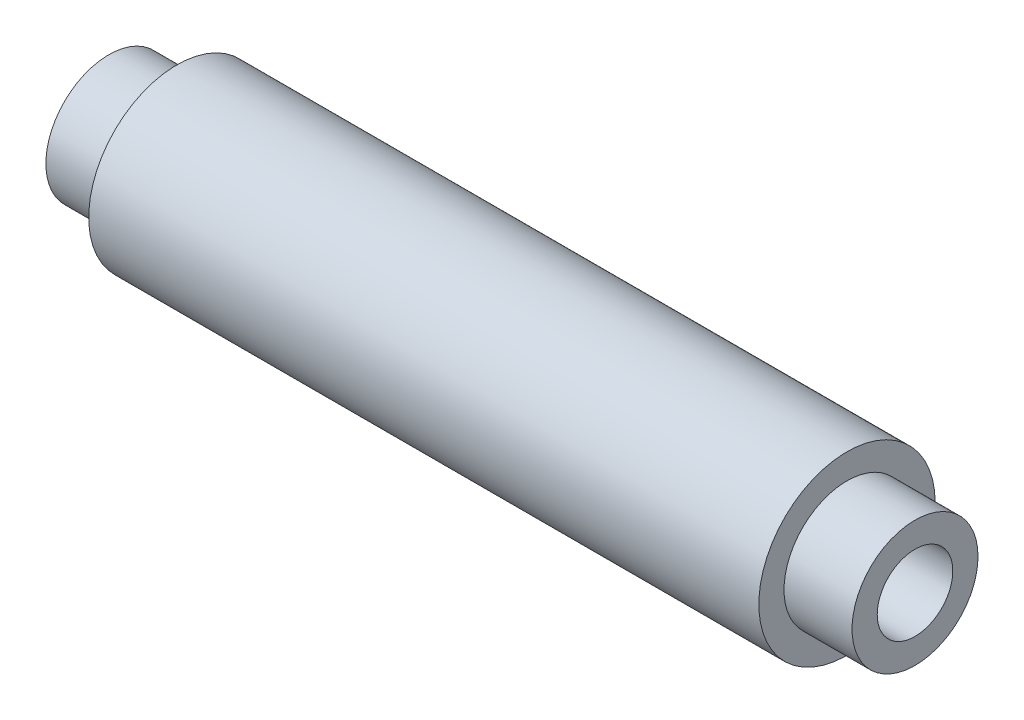
ISO-10303-21;
HEADER;
FILE_DESCRIPTION(('STEP AP214'),'2;1');
FILE_NAME('part.step','',(''),(''),'','','');
FILE_SCHEMA(('AUTOMOTIVE_DESIGN { 1 0 10303 214 1 1 1 1 }'));
ENDSEC;
DATA;
#1=APPLICATION_CONTEXT('core data for automotive mechanical design processes');
#2=APPLICATION_PROTOCOL_DEFINITION('international standard','automotive_design',2000,#1);
#3=PRODUCT_CONTEXT('',#1,'mechanical');
#4=PRODUCT('Part','Part','',(#3));
#5=PRODUCT_RELATED_PRODUCT_CATEGORY('part','',(#4));
#6=PRODUCT_DEFINITION_FORMATION('','',#4);
#7=PRODUCT_DEFINITION_CONTEXT('part definition',#1,'design');
#8=PRODUCT_DEFINITION('design','',#6,#7);
#9=PRODUCT_DEFINITION_SHAPE('','',#8);
#10=(LENGTH_UNIT() NAMED_UNIT(*) SI_UNIT(.MILLI.,.METRE.));
#11=(NAMED_UNIT(*) PLANE_ANGLE_UNIT() SI_UNIT($,.RADIAN.));
#12=(NAMED_UNIT(*) SI_UNIT($,.STERADIAN.) SOLID_ANGLE_UNIT());
#13=UNCERTAINTY_MEASURE_WITH_UNIT(LENGTH_MEASURE(1.E-05),#10,'distance_accuracy_value','');
#14=(GEOMETRIC_REPRESENTATION_CONTEXT(3) GLOBAL_UNCERTAINTY_ASSIGNED_CONTEXT((#13)) GLOBAL_UNIT_ASSIGNED_CONTEXT((#10,
#11,#12)) REPRESENTATION_CONTEXT('',''));
#15=CARTESIAN_POINT('',(0.,0.,0.));
#16=DIRECTION('',(0.,0.,1.));
#17=DIRECTION('',(1.,0.,0.));
#18=AXIS2_PLACEMENT_3D('',#15,#16,#17);
#19=CARTESIAN_POINT('',(-16.,0.,0.));
#20=DIRECTION('',(-1.,0.,0.));
#21=DIRECTION('',(0.,0.,1.));
#22=AXIS2_PLACEMENT_3D('',#19,#20,#21);
#23=CYLINDRICAL_SURFACE('',#22,1.5);
#24=CARTESIAN_POINT('',(-16.,0.,0.));
#25=DIRECTION('',(-1.,0.,0.));
#26=DIRECTION('',(0.,0.,1.));
#27=AXIS2_PLACEMENT_3D('',#24,#25,#26);
#28=CIRCLE('',#27,1.5);
#29=CARTESIAN_POINT('',(-16.,0.,1.5));
#30=VERTEX_POINT('',#29);
#31=EDGE_CURVE('E51',#30,#30,#28,.T.);
#32=ORIENTED_EDGE('',*,*,#31,.T.);
#33=EDGE_LOOP('',(#32));
#34=FACE_BOUND('',#33,.T.);
#35=CARTESIAN_POINT('',(16.,0.,0.));
#36=DIRECTION('',(-1.,0.,0.));
#37=DIRECTION('',(0.,0.,1.));
#38=AXIS2_PLACEMENT_3D('',#35,#36,#37);
#39=CIRCLE('',#38,1.5);
#40=CARTESIAN_POINT('',(16.,0.,1.5));
#41=VERTEX_POINT('',#40);
#42=EDGE_CURVE('E56',#41,#41,#39,.T.);
#43=ORIENTED_EDGE('',*,*,#42,.F.);
#44=EDGE_LOOP('',(#43));
#45=FACE_BOUND('',#44,.T.);
#46=ADVANCED_FACE('F15',(#34,#45),#23,.F.);
#47=CARTESIAN_POINT('',(16.,0.,0.));
#48=DIRECTION('',(1.,0.,0.));
#49=DIRECTION('',(0.,0.,-1.));
#50=AXIS2_PLACEMENT_3D('',#47,#48,#49);
#51=PLANE('',#50);
#52=ORIENTED_EDGE('',*,*,#42,.T.);
#53=EDGE_LOOP('',(#52));
#54=FACE_BOUND('',#53,.T.);
#55=CARTESIAN_POINT('',(16.,0.,0.));
#56=DIRECTION('',(1.,0.,0.));
#57=DIRECTION('',(0.,0.,-1.));
#58=AXIS2_PLACEMENT_3D('',#55,#56,#57);
#59=CIRCLE('',#58,2.5);
#60=CARTESIAN_POINT('',(16.,0.,-2.5));
#61=VERTEX_POINT('',#60);
#62=EDGE_CURVE('E46',#61,#61,#59,.F.);
#63=ORIENTED_EDGE('',*,*,#62,.F.);
#64=EDGE_LOOP('',(#63));
#65=FACE_BOUND('',#64,.T.);
#66=ADVANCED_FACE('F61',(#54,#65),#51,.T.);
#67=CARTESIAN_POINT('',(-16.,0.,0.));
#68=DIRECTION('',(1.,0.,0.));
#69=DIRECTION('',(0.,0.,-1.));
#70=AXIS2_PLACEMENT_3D('',#67,#68,#69);
#71=PLANE('',#70);
#72=ORIENTED_EDGE('',*,*,#31,.F.);
#73=EDGE_LOOP('',(#72));
#74=FACE_BOUND('',#73,.T.);
#75=CARTESIAN_POINT('',(-16.,0.,0.));
#76=DIRECTION('',(1.,0.,0.));
#77=DIRECTION('',(0.,0.,-1.));
#78=AXIS2_PLACEMENT_3D('',#75,#76,#77);
#79=CIRCLE('',#78,2.5);
#80=CARTESIAN_POINT('',(-16.,0.,-2.5));
#81=VERTEX_POINT('',#80);
#82=EDGE_CURVE('E41',#81,#81,#79,.T.);
#83=ORIENTED_EDGE('',*,*,#82,.F.);
#84=EDGE_LOOP('',(#83));
#85=FACE_BOUND('',#84,.T.);
#86=ADVANCED_FACE('F70',(#74,#85),#71,.F.);
#87=CARTESIAN_POINT('',(-16.,0.,0.));
#88=DIRECTION('',(1.,0.,0.));
#89=DIRECTION('',(0.,0.,-1.));
#90=AXIS2_PLACEMENT_3D('',#87,#88,#89);
#91=CYLINDRICAL_SURFACE('',#90,2.5);
#92=CARTESIAN_POINT('',(13.3,0.,0.));
#93=DIRECTION('',(1.,0.,0.));
#94=DIRECTION('',(0.,0.,-1.));
#95=AXIS2_PLACEMENT_3D('',#92,#93,#94);
#96=CIRCLE('',#95,2.5);
#97=CARTESIAN_POINT('',(13.3,0.,-2.5));
#98=VERTEX_POINT('',#97);
#99=EDGE_CURVE('E36',#98,#98,#96,.F.);
#100=ORIENTED_EDGE('',*,*,#99,.F.);
#101=EDGE_LOOP('',(#100));
#102=FACE_BOUND('',#101,.T.);
#103=ORIENTED_EDGE('',*,*,#62,.T.);
#104=EDGE_LOOP('',(#103));
#105=FACE_BOUND('',#104,.T.);
#106=ADVANCED_FACE('F89',(#102,#105),#91,.T.);
#107=CARTESIAN_POINT('',(-16.,0.,0.));
#108=DIRECTION('',(1.,0.,0.));
#109=DIRECTION('',(0.,0.,-1.));
#110=AXIS2_PLACEMENT_3D('',#107,#108,#109);
#111=CYLINDRICAL_SURFACE('',#110,2.5);
#112=ORIENTED_EDGE('',*,*,#82,.T.);
#113=EDGE_LOOP('',(#112));
#114=FACE_BOUND('',#113,.T.);
#115=CARTESIAN_POINT('',(-13.3,0.,0.));
#116=DIRECTION('',(1.,0.,0.));
#117=DIRECTION('',(0.,0.,-1.));
#118=AXIS2_PLACEMENT_3D('',#115,#116,#117);
#119=CIRCLE('',#118,2.5);
#120=CARTESIAN_POINT('',(-13.3,0.,-2.5));
#121=VERTEX_POINT('',#120);
#122=EDGE_CURVE('E27',#121,#121,#119,.F.);
#123=ORIENTED_EDGE('',*,*,#122,.T.);
#124=EDGE_LOOP('',(#123));
#125=FACE_BOUND('',#124,.T.);
#126=ADVANCED_FACE('F85',(#114,#125),#111,.T.);
#127=CARTESIAN_POINT('',(13.3,0.,0.));
#128=DIRECTION('',(1.,0.,0.));
#129=DIRECTION('',(0.,0.,-1.));
#130=AXIS2_PLACEMENT_3D('',#127,#128,#129);
#131=PLANE('',#130);
#132=ORIENTED_EDGE('',*,*,#99,.T.);
#133=EDGE_LOOP('',(#132));
#134=FACE_BOUND('',#133,.T.);
#135=CARTESIAN_POINT('',(13.3,0.,0.));
#136=DIRECTION('',(1.,0.,0.));
#137=DIRECTION('',(0.,0.,-1.));
#138=AXIS2_PLACEMENT_3D('',#135,#136,#137);
#139=CIRCLE('',#138,3.5);
#140=CARTESIAN_POINT('',(13.3,0.,-3.5));
#141=VERTEX_POINT('',#140);
#142=EDGE_CURVE('E22',#141,#141,#139,.F.);
#143=ORIENTED_EDGE('',*,*,#142,.F.);
#144=EDGE_LOOP('',(#143));
#145=FACE_BOUND('',#144,.T.);
#146=ADVANCED_FACE('F78',(#134,#145),#131,.T.);
#147=CARTESIAN_POINT('',(-13.3,0.,0.));
#148=DIRECTION('',(1.,0.,0.));
#149=DIRECTION('',(0.,0.,-1.));
#150=AXIS2_PLACEMENT_3D('',#147,#148,#149);
#151=PLANE('',#150);
#152=ORIENTED_EDGE('',*,*,#122,.F.);
#153=EDGE_LOOP('',(#152));
#154=FACE_BOUND('',#153,.T.);
#155=CARTESIAN_POINT('',(-13.3,0.,0.));
#156=DIRECTION('',(1.,0.,0.));
#157=DIRECTION('',(0.,0.,-1.));
#158=AXIS2_PLACEMENT_3D('',#155,#156,#157);
#159=CIRCLE('',#158,3.5);
#160=CARTESIAN_POINT('',(-13.3,0.,-3.5));
#161=VERTEX_POINT('',#160);
#162=EDGE_CURVE('E10',#161,#161,#159,.T.);
#163=ORIENTED_EDGE('',*,*,#162,.F.);
#164=EDGE_LOOP('',(#163));
#165=FACE_BOUND('',#164,.T.);
#166=ADVANCED_FACE('F73',(#154,#165),#151,.F.);
#167=CARTESIAN_POINT('',(-13.3,0.,0.));
#168=DIRECTION('',(1.,0.,0.));
#169=DIRECTION('',(0.,0.,-1.));
#170=AXIS2_PLACEMENT_3D('',#167,#168,#169);
#171=CYLINDRICAL_SURFACE('',#170,3.5);
#172=ORIENTED_EDGE('',*,*,#162,.T.);
#173=EDGE_LOOP('',(#172));
#174=FACE_BOUND('',#173,.T.);
#175=ORIENTED_EDGE('',*,*,#142,.T.);
#176=EDGE_LOOP('',(#175));
#177=FACE_BOUND('',#176,.T.);
#178=ADVANCED_FACE('F71',(#174,#177),#171,.T.);
#179=CLOSED_SHELL('',(#46,#66,#86,#106,#126,#146,#166,#178));
#180=MANIFOLD_SOLID_BREP('B1',#179);
#181=ADVANCED_BREP_SHAPE_REPRESENTATION('',(#18,#180),#14);
#182=SHAPE_DEFINITION_REPRESENTATION(#9,#181);
ENDSEC;
END-ISO-10303-21;
